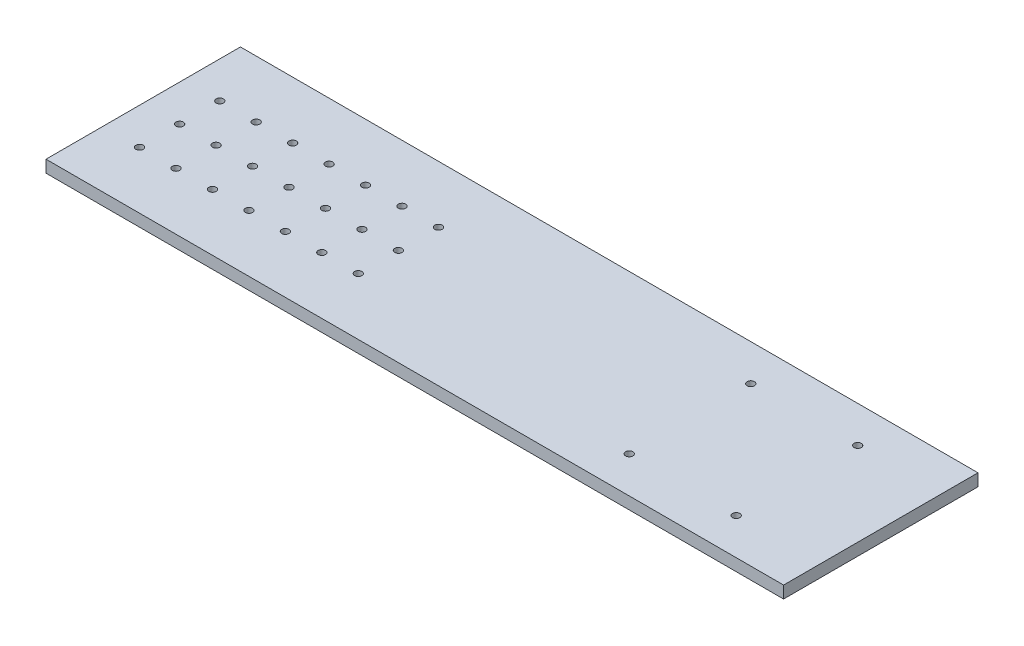
ISO-10303-21;
HEADER;
FILE_DESCRIPTION(('STEP AP214'),'2;1');
FILE_NAME('part.step','',(''),(''),'','','');
FILE_SCHEMA(('AUTOMOTIVE_DESIGN { 1 0 10303 214 1 1 1 1 }'));
ENDSEC;
DATA;
#1=APPLICATION_CONTEXT('core data for automotive mechanical design processes');
#2=APPLICATION_PROTOCOL_DEFINITION('international standard','automotive_design',2000,#1);
#3=PRODUCT_CONTEXT('',#1,'mechanical');
#4=PRODUCT('Part','Part','',(#3));
#5=PRODUCT_RELATED_PRODUCT_CATEGORY('part','',(#4));
#6=PRODUCT_DEFINITION_FORMATION('','',#4);
#7=PRODUCT_DEFINITION_CONTEXT('part definition',#1,'design');
#8=PRODUCT_DEFINITION('design','',#6,#7);
#9=PRODUCT_DEFINITION_SHAPE('','',#8);
#10=(LENGTH_UNIT() NAMED_UNIT(*) SI_UNIT(.MILLI.,.METRE.));
#11=(NAMED_UNIT(*) PLANE_ANGLE_UNIT() SI_UNIT($,.RADIAN.));
#12=(NAMED_UNIT(*) SI_UNIT($,.STERADIAN.) SOLID_ANGLE_UNIT());
#13=UNCERTAINTY_MEASURE_WITH_UNIT(LENGTH_MEASURE(1.E-05),#10,'distance_accuracy_value','');
#14=(GEOMETRIC_REPRESENTATION_CONTEXT(3) GLOBAL_UNCERTAINTY_ASSIGNED_CONTEXT((#13)) GLOBAL_UNIT_ASSIGNED_CONTEXT((#10,
#11,#12)) REPRESENTATION_CONTEXT('',''));
#15=CARTESIAN_POINT('',(0.,0.,0.));
#16=DIRECTION('',(0.,0.,1.));
#17=DIRECTION('',(1.,0.,0.));
#18=AXIS2_PLACEMENT_3D('',#15,#16,#17);
#19=CARTESIAN_POINT('',(303.5,10.,-80.));
#20=DIRECTION('',(-1.,0.,0.));
#21=DIRECTION('',(0.,0.,1.));
#22=AXIS2_PLACEMENT_3D('',#19,#20,#21);
#23=PLANE('',#22);
#24=DIRECTION('',(0.,0.,-1.));
#25=VECTOR('',#24,1.);
#26=CARTESIAN_POINT('',(303.5,0.,-80.));
#27=LINE('',#26,#25);
#28=CARTESIAN_POINT('',(303.5,0.,80.));
#29=VERTEX_POINT('',#28);
#30=CARTESIAN_POINT('',(303.5,0.,-80.));
#31=VERTEX_POINT('',#30);
#32=EDGE_CURVE('E96',#29,#31,#27,.T.);
#33=ORIENTED_EDGE('',*,*,#32,.T.);
#34=DIRECTION('',(0.,-1.,0.));
#35=VECTOR('',#34,1.);
#36=CARTESIAN_POINT('',(303.5,10.,-80.));
#37=LINE('',#36,#35);
#38=CARTESIAN_POINT('',(303.5,10.,-80.));
#39=VERTEX_POINT('',#38);
#40=EDGE_CURVE('E11',#39,#31,#37,.T.);
#41=ORIENTED_EDGE('',*,*,#40,.F.);
#42=DIRECTION('',(0.,0.,-1.));
#43=VECTOR('',#42,1.);
#44=CARTESIAN_POINT('',(303.5,10.,-80.));
#45=LINE('',#44,#43);
#46=CARTESIAN_POINT('',(303.5,10.,80.));
#47=VERTEX_POINT('',#46);
#48=EDGE_CURVE('E84',#47,#39,#45,.T.);
#49=ORIENTED_EDGE('',*,*,#48,.F.);
#50=DIRECTION('',(0.,-1.,0.));
#51=VECTOR('',#50,1.);
#52=CARTESIAN_POINT('',(303.5,10.,80.));
#53=LINE('',#52,#51);
#54=EDGE_CURVE('E92',#47,#29,#53,.T.);
#55=ORIENTED_EDGE('',*,*,#54,.T.);
#56=EDGE_LOOP('',(#33,#41,#49,#55));
#57=FACE_BOUND('',#56,.T.);
#58=ADVANCED_FACE('F33',(#57),#23,.F.);
#59=CARTESIAN_POINT('',(-303.5,10.,-80.));
#60=DIRECTION('',(0.,0.,1.));
#61=DIRECTION('',(1.,0.,0.));
#62=AXIS2_PLACEMENT_3D('',#59,#60,#61);
#63=PLANE('',#62);
#64=DIRECTION('',(-1.,0.,0.));
#65=VECTOR('',#64,1.);
#66=CARTESIAN_POINT('',(-303.5,0.,-80.));
#67=LINE('',#66,#65);
#68=CARTESIAN_POINT('',(-303.5,0.,-80.));
#69=VERTEX_POINT('',#68);
#70=EDGE_CURVE('E88',#31,#69,#67,.T.);
#71=ORIENTED_EDGE('',*,*,#70,.T.);
#72=DIRECTION('',(0.,-1.,0.));
#73=VECTOR('',#72,1.);
#74=CARTESIAN_POINT('',(-303.5,10.,-80.));
#75=LINE('',#74,#73);
#76=CARTESIAN_POINT('',(-303.5,10.,-80.));
#77=VERTEX_POINT('',#76);
#78=EDGE_CURVE('E41',#77,#69,#75,.T.);
#79=ORIENTED_EDGE('',*,*,#78,.F.);
#80=DIRECTION('',(-1.,0.,0.));
#81=VECTOR('',#80,1.);
#82=CARTESIAN_POINT('',(-303.5,10.,-80.));
#83=LINE('',#82,#81);
#84=EDGE_CURVE('E79',#39,#77,#83,.T.);
#85=ORIENTED_EDGE('',*,*,#84,.F.);
#86=ORIENTED_EDGE('',*,*,#40,.T.);
#87=EDGE_LOOP('',(#71,#79,#85,#86));
#88=FACE_BOUND('',#87,.T.);
#89=ADVANCED_FACE('F87',(#88),#63,.F.);
#90=CARTESIAN_POINT('',(-303.5,10.,-80.));
#91=DIRECTION('',(1.,0.,0.));
#92=DIRECTION('',(0.,0.,-1.));
#93=AXIS2_PLACEMENT_3D('',#90,#91,#92);
#94=PLANE('',#93);
#95=DIRECTION('',(0.,0.,1.));
#96=VECTOR('',#95,1.);
#97=CARTESIAN_POINT('',(-303.5,0.,-80.));
#98=LINE('',#97,#96);
#99=CARTESIAN_POINT('',(-303.5,0.,80.));
#100=VERTEX_POINT('',#99);
#101=EDGE_CURVE('E66',#69,#100,#98,.T.);
#102=ORIENTED_EDGE('',*,*,#101,.T.);
#103=DIRECTION('',(0.,-1.,0.));
#104=VECTOR('',#103,1.);
#105=CARTESIAN_POINT('',(-303.5,10.,80.));
#106=LINE('',#105,#104);
#107=CARTESIAN_POINT('',(-303.5,10.,80.));
#108=VERTEX_POINT('',#107);
#109=EDGE_CURVE('E89',#108,#100,#106,.T.);
#110=ORIENTED_EDGE('',*,*,#109,.F.);
#111=DIRECTION('',(0.,0.,1.));
#112=VECTOR('',#111,1.);
#113=CARTESIAN_POINT('',(-303.5,10.,-80.));
#114=LINE('',#113,#112);
#115=EDGE_CURVE('E82',#77,#108,#114,.T.);
#116=ORIENTED_EDGE('',*,*,#115,.F.);
#117=ORIENTED_EDGE('',*,*,#78,.T.);
#118=EDGE_LOOP('',(#102,#110,#116,#117));
#119=FACE_BOUND('',#118,.T.);
#120=ADVANCED_FACE('F90',(#119),#94,.F.);
#121=CARTESIAN_POINT('',(-303.5,10.,80.));
#122=DIRECTION('',(0.,0.,-1.));
#123=DIRECTION('',(-1.,0.,0.));
#124=AXIS2_PLACEMENT_3D('',#121,#122,#123);
#125=PLANE('',#124);
#126=DIRECTION('',(1.,0.,0.));
#127=VECTOR('',#126,1.);
#128=CARTESIAN_POINT('',(-303.5,0.,80.));
#129=LINE('',#128,#127);
#130=EDGE_CURVE('E72',#100,#29,#129,.T.);
#131=ORIENTED_EDGE('',*,*,#130,.T.);
#132=ORIENTED_EDGE('',*,*,#54,.F.);
#133=DIRECTION('',(1.,0.,0.));
#134=VECTOR('',#133,1.);
#135=CARTESIAN_POINT('',(-303.5,10.,80.));
#136=LINE('',#135,#134);
#137=EDGE_CURVE('E49',#108,#47,#136,.T.);
#138=ORIENTED_EDGE('',*,*,#137,.F.);
#139=ORIENTED_EDGE('',*,*,#109,.T.);
#140=EDGE_LOOP('',(#131,#132,#138,#139));
#141=FACE_BOUND('',#140,.T.);
#142=ADVANCED_FACE('F104',(#141),#125,.F.);
#143=CARTESIAN_POINT('',(0.,10.,0.));
#144=DIRECTION('',(0.,1.,0.));
#145=DIRECTION('',(0.,0.,1.));
#146=AXIS2_PLACEMENT_3D('',#143,#144,#145);
#147=PLANE('',#146);
#148=CARTESIAN_POINT('',(-273.5,10.,-4.18977760661176E-13));
#149=DIRECTION('',(0.,1.,0.));
#150=DIRECTION('',(0.,0.,1.));
#151=AXIS2_PLACEMENT_3D('',#148,#149,#150);
#152=CIRCLE('',#151,2.99999999999999);
#153=CARTESIAN_POINT('',(-273.5,10.,2.99999999999958));
#154=VERTEX_POINT('',#153);
#155=EDGE_CURVE('E253',#154,#154,#152,.F.);
#156=ORIENTED_EDGE('',*,*,#155,.T.);
#157=EDGE_LOOP('',(#156));
#158=FACE_BOUND('',#157,.T.);
#159=CARTESIAN_POINT('',(-273.5,10.,-33.0000000000004));
#160=DIRECTION('',(0.,1.,0.));
#161=DIRECTION('',(0.,0.,1.));
#162=AXIS2_PLACEMENT_3D('',#159,#160,#161);
#163=CIRCLE('',#162,2.99999999999999);
#164=CARTESIAN_POINT('',(-273.5,10.,-30.0000000000004));
#165=VERTEX_POINT('',#164);
#166=EDGE_CURVE('E247',#165,#165,#163,.F.);
#167=ORIENTED_EDGE('',*,*,#166,.T.);
#168=EDGE_LOOP('',(#167));
#169=FACE_BOUND('',#168,.T.);
#170=CARTESIAN_POINT('',(-273.5,10.,32.9999999999996));
#171=DIRECTION('',(0.,1.,0.));
#172=DIRECTION('',(0.,0.,1.));
#173=AXIS2_PLACEMENT_3D('',#170,#171,#172);
#174=CIRCLE('',#173,2.99999999999999);
#175=CARTESIAN_POINT('',(-273.5,10.,35.9999999999996));
#176=VERTEX_POINT('',#175);
#177=EDGE_CURVE('E241',#176,#176,#174,.F.);
#178=ORIENTED_EDGE('',*,*,#177,.T.);
#179=EDGE_LOOP('',(#178));
#180=FACE_BOUND('',#179,.T.);
#181=CARTESIAN_POINT('',(-243.5,10.,-2.09488880330588E-13));
#182=DIRECTION('',(0.,1.,0.));
#183=DIRECTION('',(0.,0.,1.));
#184=AXIS2_PLACEMENT_3D('',#181,#182,#183);
#185=CIRCLE('',#184,2.99999999999999);
#186=CARTESIAN_POINT('',(-243.5,10.,2.99999999999979));
#187=VERTEX_POINT('',#186);
#188=EDGE_CURVE('E235',#187,#187,#185,.F.);
#189=ORIENTED_EDGE('',*,*,#188,.T.);
#190=EDGE_LOOP('',(#189));
#191=FACE_BOUND('',#190,.T.);
#192=CARTESIAN_POINT('',(-243.5,10.,-33.0000000000002));
#193=DIRECTION('',(0.,1.,0.));
#194=DIRECTION('',(0.,0.,1.));
#195=AXIS2_PLACEMENT_3D('',#192,#193,#194);
#196=CIRCLE('',#195,2.99999999999999);
#197=CARTESIAN_POINT('',(-243.5,10.,-30.0000000000002));
#198=VERTEX_POINT('',#197);
#199=EDGE_CURVE('E229',#198,#198,#196,.F.);
#200=ORIENTED_EDGE('',*,*,#199,.T.);
#201=EDGE_LOOP('',(#200));
#202=FACE_BOUND('',#201,.T.);
#203=CARTESIAN_POINT('',(-243.5,10.,32.9999999999998));
#204=DIRECTION('',(0.,1.,0.));
#205=DIRECTION('',(0.,0.,1.));
#206=AXIS2_PLACEMENT_3D('',#203,#204,#205);
#207=CIRCLE('',#206,2.99999999999999);
#208=CARTESIAN_POINT('',(-243.5,10.,35.9999999999998));
#209=VERTEX_POINT('',#208);
#210=EDGE_CURVE('E223',#209,#209,#207,.F.);
#211=ORIENTED_EDGE('',*,*,#210,.T.);
#212=EDGE_LOOP('',(#211));
#213=FACE_BOUND('',#212,.T.);
#214=CARTESIAN_POINT('',(-213.5,10.,0.));
#215=DIRECTION('',(0.,1.,0.));
#216=DIRECTION('',(0.,0.,1.));
#217=AXIS2_PLACEMENT_3D('',#214,#215,#216);
#218=CIRCLE('',#217,2.99999999999999);
#219=CARTESIAN_POINT('',(-213.5,10.,2.99999999999999));
#220=VERTEX_POINT('',#219);
#221=EDGE_CURVE('E217',#220,#220,#218,.F.);
#222=ORIENTED_EDGE('',*,*,#221,.T.);
#223=EDGE_LOOP('',(#222));
#224=FACE_BOUND('',#223,.T.);
#225=CARTESIAN_POINT('',(234.5,10.,-50.));
#226=DIRECTION('',(0.,1.,0.));
#227=DIRECTION('',(0.,0.,1.));
#228=AXIS2_PLACEMENT_3D('',#225,#226,#227);
#229=CIRCLE('',#228,2.99999999999999);
#230=CARTESIAN_POINT('',(234.5,10.,-47.));
#231=VERTEX_POINT('',#230);
#232=EDGE_CURVE('E211',#231,#231,#229,.F.);
#233=ORIENTED_EDGE('',*,*,#232,.T.);
#234=EDGE_LOOP('',(#233));
#235=FACE_BOUND('',#234,.T.);
#236=CARTESIAN_POINT('',(234.5,10.,50.));
#237=DIRECTION('',(0.,1.,0.));
#238=DIRECTION('',(0.,0.,1.));
#239=AXIS2_PLACEMENT_3D('',#236,#237,#238);
#240=CIRCLE('',#239,2.99999999999999);
#241=CARTESIAN_POINT('',(234.5,10.,53.));
#242=VERTEX_POINT('',#241);
#243=EDGE_CURVE('E205',#242,#242,#240,.F.);
#244=ORIENTED_EDGE('',*,*,#243,.T.);
#245=EDGE_LOOP('',(#244));
#246=FACE_BOUND('',#245,.T.);
#247=CARTESIAN_POINT('',(146.5,10.,50.));
#248=DIRECTION('',(0.,1.,0.));
#249=DIRECTION('',(0.,0.,1.));
#250=AXIS2_PLACEMENT_3D('',#247,#248,#249);
#251=CIRCLE('',#250,2.99999999999999);
#252=CARTESIAN_POINT('',(146.5,10.,53.));
#253=VERTEX_POINT('',#252);
#254=EDGE_CURVE('E199',#253,#253,#251,.F.);
#255=ORIENTED_EDGE('',*,*,#254,.T.);
#256=EDGE_LOOP('',(#255));
#257=FACE_BOUND('',#256,.T.);
#258=CARTESIAN_POINT('',(146.5,10.,-50.));
#259=DIRECTION('',(0.,1.,0.));
#260=DIRECTION('',(0.,0.,1.));
#261=AXIS2_PLACEMENT_3D('',#258,#259,#260);
#262=CIRCLE('',#261,2.99999999999999);
#263=CARTESIAN_POINT('',(146.5,10.,-47.));
#264=VERTEX_POINT('',#263);
#265=EDGE_CURVE('E193',#264,#264,#262,.F.);
#266=ORIENTED_EDGE('',*,*,#265,.T.);
#267=EDGE_LOOP('',(#266));
#268=FACE_BOUND('',#267,.T.);
#269=CARTESIAN_POINT('',(-93.5000000000003,10.,0.));
#270=DIRECTION('',(0.,1.,0.));
#271=DIRECTION('',(0.,0.,1.));
#272=AXIS2_PLACEMENT_3D('',#269,#270,#271);
#273=CIRCLE('',#272,2.99999999999999);
#274=CARTESIAN_POINT('',(-93.5000000000003,10.,2.99999999999999));
#275=VERTEX_POINT('',#274);
#276=EDGE_CURVE('E187',#275,#275,#273,.F.);
#277=ORIENTED_EDGE('',*,*,#276,.T.);
#278=EDGE_LOOP('',(#277));
#279=FACE_BOUND('',#278,.T.);
#280=CARTESIAN_POINT('',(-93.5000000000003,10.,33.));
#281=DIRECTION('',(0.,1.,0.));
#282=DIRECTION('',(0.,0.,1.));
#283=AXIS2_PLACEMENT_3D('',#280,#281,#282);
#284=CIRCLE('',#283,2.99999999999999);
#285=CARTESIAN_POINT('',(-93.5000000000003,10.,36.));
#286=VERTEX_POINT('',#285);
#287=EDGE_CURVE('E181',#286,#286,#284,.F.);
#288=ORIENTED_EDGE('',*,*,#287,.T.);
#289=EDGE_LOOP('',(#288));
#290=FACE_BOUND('',#289,.T.);
#291=CARTESIAN_POINT('',(-123.5,10.,0.));
#292=DIRECTION('',(0.,1.,0.));
#293=DIRECTION('',(0.,0.,1.));
#294=AXIS2_PLACEMENT_3D('',#291,#292,#293);
#295=CIRCLE('',#294,3.00000000000005);
#296=CARTESIAN_POINT('',(-123.5,10.,3.00000000000005));
#297=VERTEX_POINT('',#296);
#298=EDGE_CURVE('E175',#297,#297,#295,.F.);
#299=ORIENTED_EDGE('',*,*,#298,.T.);
#300=EDGE_LOOP('',(#299));
#301=FACE_BOUND('',#300,.T.);
#302=CARTESIAN_POINT('',(-123.5,10.,33.));
#303=DIRECTION('',(0.,1.,0.));
#304=DIRECTION('',(0.,0.,1.));
#305=AXIS2_PLACEMENT_3D('',#302,#303,#304);
#306=CIRCLE('',#305,3.00000000000005);
#307=CARTESIAN_POINT('',(-123.5,10.,36.));
#308=VERTEX_POINT('',#307);
#309=EDGE_CURVE('E169',#308,#308,#306,.F.);
#310=ORIENTED_EDGE('',*,*,#309,.T.);
#311=EDGE_LOOP('',(#310));
#312=FACE_BOUND('',#311,.T.);
#313=CARTESIAN_POINT('',(-153.5,10.,0.));
#314=DIRECTION('',(0.,1.,0.));
#315=DIRECTION('',(0.,0.,1.));
#316=AXIS2_PLACEMENT_3D('',#313,#314,#315);
#317=CIRCLE('',#316,2.99999999999999);
#318=CARTESIAN_POINT('',(-153.5,10.,2.99999999999999));
#319=VERTEX_POINT('',#318);
#320=EDGE_CURVE('E163',#319,#319,#317,.F.);
#321=ORIENTED_EDGE('',*,*,#320,.T.);
#322=EDGE_LOOP('',(#321));
#323=FACE_BOUND('',#322,.T.);
#324=CARTESIAN_POINT('',(-153.5,10.,33.));
#325=DIRECTION('',(0.,1.,0.));
#326=DIRECTION('',(0.,0.,1.));
#327=AXIS2_PLACEMENT_3D('',#324,#325,#326);
#328=CIRCLE('',#327,2.99999999999999);
#329=CARTESIAN_POINT('',(-153.5,10.,36.));
#330=VERTEX_POINT('',#329);
#331=EDGE_CURVE('E157',#330,#330,#328,.F.);
#332=ORIENTED_EDGE('',*,*,#331,.T.);
#333=EDGE_LOOP('',(#332));
#334=FACE_BOUND('',#333,.T.);
#335=CARTESIAN_POINT('',(-213.5,10.,-33.));
#336=DIRECTION('',(0.,1.,0.));
#337=DIRECTION('',(0.,0.,1.));
#338=AXIS2_PLACEMENT_3D('',#335,#336,#337);
#339=CIRCLE('',#338,2.99999999999999);
#340=CARTESIAN_POINT('',(-213.5,10.,-30.));
#341=VERTEX_POINT('',#340);
#342=EDGE_CURVE('E151',#341,#341,#339,.F.);
#343=ORIENTED_EDGE('',*,*,#342,.T.);
#344=EDGE_LOOP('',(#343));
#345=FACE_BOUND('',#344,.T.);
#346=CARTESIAN_POINT('',(-213.5,10.,33.));
#347=DIRECTION('',(0.,1.,0.));
#348=DIRECTION('',(0.,0.,1.));
#349=AXIS2_PLACEMENT_3D('',#346,#347,#348);
#350=CIRCLE('',#349,2.99999999999999);
#351=CARTESIAN_POINT('',(-213.5,10.,36.));
#352=VERTEX_POINT('',#351);
#353=EDGE_CURVE('E145',#352,#352,#350,.F.);
#354=ORIENTED_EDGE('',*,*,#353,.T.);
#355=EDGE_LOOP('',(#354));
#356=FACE_BOUND('',#355,.T.);
#357=CARTESIAN_POINT('',(-183.5,10.,0.));
#358=DIRECTION('',(0.,1.,0.));
#359=DIRECTION('',(0.,0.,1.));
#360=AXIS2_PLACEMENT_3D('',#357,#358,#359);
#361=CIRCLE('',#360,2.99999999999994);
#362=CARTESIAN_POINT('',(-183.5,10.,2.99999999999994));
#363=VERTEX_POINT('',#362);
#364=EDGE_CURVE('E139',#363,#363,#361,.F.);
#365=ORIENTED_EDGE('',*,*,#364,.T.);
#366=EDGE_LOOP('',(#365));
#367=FACE_BOUND('',#366,.T.);
#368=CARTESIAN_POINT('',(-183.5,10.,33.));
#369=DIRECTION('',(0.,1.,0.));
#370=DIRECTION('',(0.,0.,1.));
#371=AXIS2_PLACEMENT_3D('',#368,#369,#370);
#372=CIRCLE('',#371,2.99999999999994);
#373=CARTESIAN_POINT('',(-183.5,10.,35.9999999999999));
#374=VERTEX_POINT('',#373);
#375=EDGE_CURVE('E133',#374,#374,#372,.F.);
#376=ORIENTED_EDGE('',*,*,#375,.T.);
#377=EDGE_LOOP('',(#376));
#378=FACE_BOUND('',#377,.T.);
#379=CARTESIAN_POINT('',(-183.5,10.,-33.));
#380=DIRECTION('',(0.,1.,0.));
#381=DIRECTION('',(0.,0.,1.));
#382=AXIS2_PLACEMENT_3D('',#379,#380,#381);
#383=CIRCLE('',#382,2.99999999999994);
#384=CARTESIAN_POINT('',(-183.5,10.,-30.0000000000001));
#385=VERTEX_POINT('',#384);
#386=EDGE_CURVE('E127',#385,#385,#383,.F.);
#387=ORIENTED_EDGE('',*,*,#386,.T.);
#388=EDGE_LOOP('',(#387));
#389=FACE_BOUND('',#388,.T.);
#390=CARTESIAN_POINT('',(-153.5,10.,-33.));
#391=DIRECTION('',(0.,1.,0.));
#392=DIRECTION('',(0.,0.,1.));
#393=AXIS2_PLACEMENT_3D('',#390,#391,#392);
#394=CIRCLE('',#393,2.99999999999999);
#395=CARTESIAN_POINT('',(-153.5,10.,-30.));
#396=VERTEX_POINT('',#395);
#397=EDGE_CURVE('E121',#396,#396,#394,.F.);
#398=ORIENTED_EDGE('',*,*,#397,.T.);
#399=EDGE_LOOP('',(#398));
#400=FACE_BOUND('',#399,.T.);
#401=CARTESIAN_POINT('',(-123.5,10.,-33.));
#402=DIRECTION('',(0.,1.,0.));
#403=DIRECTION('',(0.,0.,1.));
#404=AXIS2_PLACEMENT_3D('',#401,#402,#403);
#405=CIRCLE('',#404,3.00000000000005);
#406=CARTESIAN_POINT('',(-123.5,10.,-30.));
#407=VERTEX_POINT('',#406);
#408=EDGE_CURVE('E115',#407,#407,#405,.F.);
#409=ORIENTED_EDGE('',*,*,#408,.T.);
#410=EDGE_LOOP('',(#409));
#411=FACE_BOUND('',#410,.T.);
#412=CARTESIAN_POINT('',(-93.5000000000003,10.,-33.));
#413=DIRECTION('',(0.,1.,0.));
#414=DIRECTION('',(0.,0.,1.));
#415=AXIS2_PLACEMENT_3D('',#412,#413,#414);
#416=CIRCLE('',#415,2.99999999999999);
#417=CARTESIAN_POINT('',(-93.5000000000003,10.,-30.));
#418=VERTEX_POINT('',#417);
#419=EDGE_CURVE('E99',#418,#418,#416,.F.);
#420=ORIENTED_EDGE('',*,*,#419,.T.);
#421=EDGE_LOOP('',(#420));
#422=FACE_BOUND('',#421,.T.);
#423=ORIENTED_EDGE('',*,*,#48,.T.);
#424=ORIENTED_EDGE('',*,*,#84,.T.);
#425=ORIENTED_EDGE('',*,*,#115,.T.);
#426=ORIENTED_EDGE('',*,*,#137,.T.);
#427=EDGE_LOOP('',(#423,#424,#425,#426));
#428=FACE_BOUND('',#427,.T.);
#429=ADVANCED_FACE('F80',(#158,#169,#180,#191,#202,#213,#224,#235,#246,#257,#268,#279,#290,#301,
#312,#323,#334,#345,#356,#367,#378,#389,#400,#411,#422,#428),#147,.T.);
#430=CARTESIAN_POINT('',(0.,0.,0.));
#431=DIRECTION('',(0.,1.,0.));
#432=DIRECTION('',(0.,0.,1.));
#433=AXIS2_PLACEMENT_3D('',#430,#431,#432);
#434=PLANE('',#433);
#435=CARTESIAN_POINT('',(-273.5,0.,-4.18977760661176E-13));
#436=DIRECTION('',(0.,-1.,0.));
#437=DIRECTION('',(0.,0.,-1.));
#438=AXIS2_PLACEMENT_3D('',#435,#436,#437);
#439=CIRCLE('',#438,2.99999999999999);
#440=CARTESIAN_POINT('',(-273.5,0.,-3.00000000000041));
#441=VERTEX_POINT('',#440);
#442=EDGE_CURVE('E256',#441,#441,#439,.T.);
#443=ORIENTED_EDGE('',*,*,#442,.F.);
#444=EDGE_LOOP('',(#443));
#445=FACE_BOUND('',#444,.T.);
#446=CARTESIAN_POINT('',(-273.5,0.,-33.0000000000004));
#447=DIRECTION('',(0.,-1.,0.));
#448=DIRECTION('',(0.,0.,-1.));
#449=AXIS2_PLACEMENT_3D('',#446,#447,#448);
#450=CIRCLE('',#449,2.99999999999999);
#451=CARTESIAN_POINT('',(-273.5,0.,-36.0000000000004));
#452=VERTEX_POINT('',#451);
#453=EDGE_CURVE('E250',#452,#452,#450,.T.);
#454=ORIENTED_EDGE('',*,*,#453,.F.);
#455=EDGE_LOOP('',(#454));
#456=FACE_BOUND('',#455,.T.);
#457=CARTESIAN_POINT('',(-273.5,0.,32.9999999999996));
#458=DIRECTION('',(0.,-1.,0.));
#459=DIRECTION('',(0.,0.,1.));
#460=AXIS2_PLACEMENT_3D('',#457,#458,#459);
#461=CIRCLE('',#460,2.99999999999999);
#462=CARTESIAN_POINT('',(-273.5,0.,35.9999999999996));
#463=VERTEX_POINT('',#462);
#464=EDGE_CURVE('E244',#463,#463,#461,.T.);
#465=ORIENTED_EDGE('',*,*,#464,.F.);
#466=EDGE_LOOP('',(#465));
#467=FACE_BOUND('',#466,.T.);
#468=CARTESIAN_POINT('',(-243.5,0.,-2.09488880330588E-13));
#469=DIRECTION('',(0.,-1.,0.));
#470=DIRECTION('',(0.,0.,-1.));
#471=AXIS2_PLACEMENT_3D('',#468,#469,#470);
#472=CIRCLE('',#471,2.99999999999999);
#473=CARTESIAN_POINT('',(-243.5,0.,-3.0000000000002));
#474=VERTEX_POINT('',#473);
#475=EDGE_CURVE('E238',#474,#474,#472,.T.);
#476=ORIENTED_EDGE('',*,*,#475,.F.);
#477=EDGE_LOOP('',(#476));
#478=FACE_BOUND('',#477,.T.);
#479=CARTESIAN_POINT('',(-243.5,0.,-33.0000000000002));
#480=DIRECTION('',(0.,-1.,0.));
#481=DIRECTION('',(0.,0.,-1.));
#482=AXIS2_PLACEMENT_3D('',#479,#480,#481);
#483=CIRCLE('',#482,2.99999999999999);
#484=CARTESIAN_POINT('',(-243.5,0.,-36.0000000000002));
#485=VERTEX_POINT('',#484);
#486=EDGE_CURVE('E232',#485,#485,#483,.T.);
#487=ORIENTED_EDGE('',*,*,#486,.F.);
#488=EDGE_LOOP('',(#487));
#489=FACE_BOUND('',#488,.T.);
#490=CARTESIAN_POINT('',(-243.5,0.,32.9999999999998));
#491=DIRECTION('',(0.,-1.,0.));
#492=DIRECTION('',(0.,0.,1.));
#493=AXIS2_PLACEMENT_3D('',#490,#491,#492);
#494=CIRCLE('',#493,2.99999999999999);
#495=CARTESIAN_POINT('',(-243.5,0.,35.9999999999998));
#496=VERTEX_POINT('',#495);
#497=EDGE_CURVE('E226',#496,#496,#494,.T.);
#498=ORIENTED_EDGE('',*,*,#497,.F.);
#499=EDGE_LOOP('',(#498));
#500=FACE_BOUND('',#499,.T.);
#501=CARTESIAN_POINT('',(-213.5,0.,0.));
#502=DIRECTION('',(0.,-1.,0.));
#503=DIRECTION('',(0.,0.,-1.));
#504=AXIS2_PLACEMENT_3D('',#501,#502,#503);
#505=CIRCLE('',#504,2.99999999999999);
#506=CARTESIAN_POINT('',(-213.5,0.,-2.99999999999999));
#507=VERTEX_POINT('',#506);
#508=EDGE_CURVE('E220',#507,#507,#505,.T.);
#509=ORIENTED_EDGE('',*,*,#508,.F.);
#510=EDGE_LOOP('',(#509));
#511=FACE_BOUND('',#510,.T.);
#512=CARTESIAN_POINT('',(234.5,0.,-50.));
#513=DIRECTION('',(0.,-1.,0.));
#514=DIRECTION('',(0.,0.,1.));
#515=AXIS2_PLACEMENT_3D('',#512,#513,#514);
#516=CIRCLE('',#515,2.99999999999999);
#517=CARTESIAN_POINT('',(234.5,0.,-47.));
#518=VERTEX_POINT('',#517);
#519=EDGE_CURVE('E214',#518,#518,#516,.T.);
#520=ORIENTED_EDGE('',*,*,#519,.F.);
#521=EDGE_LOOP('',(#520));
#522=FACE_BOUND('',#521,.T.);
#523=CARTESIAN_POINT('',(234.5,0.,50.));
#524=DIRECTION('',(0.,-1.,0.));
#525=DIRECTION('',(0.,0.,-1.));
#526=AXIS2_PLACEMENT_3D('',#523,#524,#525);
#527=CIRCLE('',#526,2.99999999999999);
#528=CARTESIAN_POINT('',(234.5,0.,47.));
#529=VERTEX_POINT('',#528);
#530=EDGE_CURVE('E208',#529,#529,#527,.T.);
#531=ORIENTED_EDGE('',*,*,#530,.F.);
#532=EDGE_LOOP('',(#531));
#533=FACE_BOUND('',#532,.T.);
#534=CARTESIAN_POINT('',(146.5,0.,50.));
#535=DIRECTION('',(0.,-1.,0.));
#536=DIRECTION('',(0.,0.,-1.));
#537=AXIS2_PLACEMENT_3D('',#534,#535,#536);
#538=CIRCLE('',#537,2.99999999999999);
#539=CARTESIAN_POINT('',(146.5,0.,47.));
#540=VERTEX_POINT('',#539);
#541=EDGE_CURVE('E202',#540,#540,#538,.T.);
#542=ORIENTED_EDGE('',*,*,#541,.F.);
#543=EDGE_LOOP('',(#542));
#544=FACE_BOUND('',#543,.T.);
#545=CARTESIAN_POINT('',(146.5,0.,-50.));
#546=DIRECTION('',(0.,-1.,0.));
#547=DIRECTION('',(0.,0.,1.));
#548=AXIS2_PLACEMENT_3D('',#545,#546,#547);
#549=CIRCLE('',#548,2.99999999999999);
#550=CARTESIAN_POINT('',(146.5,0.,-47.));
#551=VERTEX_POINT('',#550);
#552=EDGE_CURVE('E196',#551,#551,#549,.T.);
#553=ORIENTED_EDGE('',*,*,#552,.F.);
#554=EDGE_LOOP('',(#553));
#555=FACE_BOUND('',#554,.T.);
#556=CARTESIAN_POINT('',(-93.5000000000003,0.,0.));
#557=DIRECTION('',(0.,-1.,0.));
#558=DIRECTION('',(0.,0.,-1.));
#559=AXIS2_PLACEMENT_3D('',#556,#557,#558);
#560=CIRCLE('',#559,2.99999999999999);
#561=CARTESIAN_POINT('',(-93.5000000000003,0.,-2.99999999999999));
#562=VERTEX_POINT('',#561);
#563=EDGE_CURVE('E190',#562,#562,#560,.T.);
#564=ORIENTED_EDGE('',*,*,#563,.F.);
#565=EDGE_LOOP('',(#564));
#566=FACE_BOUND('',#565,.T.);
#567=CARTESIAN_POINT('',(-93.5000000000003,0.,33.));
#568=DIRECTION('',(0.,-1.,0.));
#569=DIRECTION('',(0.,0.,1.));
#570=AXIS2_PLACEMENT_3D('',#567,#568,#569);
#571=CIRCLE('',#570,2.99999999999999);
#572=CARTESIAN_POINT('',(-93.5000000000003,0.,36.));
#573=VERTEX_POINT('',#572);
#574=EDGE_CURVE('E184',#573,#573,#571,.T.);
#575=ORIENTED_EDGE('',*,*,#574,.F.);
#576=EDGE_LOOP('',(#575));
#577=FACE_BOUND('',#576,.T.);
#578=CARTESIAN_POINT('',(-123.5,0.,0.));
#579=DIRECTION('',(0.,-1.,0.));
#580=DIRECTION('',(0.,0.,-1.));
#581=AXIS2_PLACEMENT_3D('',#578,#579,#580);
#582=CIRCLE('',#581,3.00000000000005);
#583=CARTESIAN_POINT('',(-123.5,0.,-3.00000000000005));
#584=VERTEX_POINT('',#583);
#585=EDGE_CURVE('E178',#584,#584,#582,.T.);
#586=ORIENTED_EDGE('',*,*,#585,.F.);
#587=EDGE_LOOP('',(#586));
#588=FACE_BOUND('',#587,.T.);
#589=CARTESIAN_POINT('',(-123.5,0.,33.));
#590=DIRECTION('',(0.,-1.,0.));
#591=DIRECTION('',(0.,0.,1.));
#592=AXIS2_PLACEMENT_3D('',#589,#590,#591);
#593=CIRCLE('',#592,3.00000000000005);
#594=CARTESIAN_POINT('',(-123.5,0.,36.));
#595=VERTEX_POINT('',#594);
#596=EDGE_CURVE('E172',#595,#595,#593,.T.);
#597=ORIENTED_EDGE('',*,*,#596,.F.);
#598=EDGE_LOOP('',(#597));
#599=FACE_BOUND('',#598,.T.);
#600=CARTESIAN_POINT('',(-153.5,0.,0.));
#601=DIRECTION('',(0.,-1.,0.));
#602=DIRECTION('',(0.,0.,-1.));
#603=AXIS2_PLACEMENT_3D('',#600,#601,#602);
#604=CIRCLE('',#603,2.99999999999999);
#605=CARTESIAN_POINT('',(-153.5,0.,-2.99999999999999));
#606=VERTEX_POINT('',#605);
#607=EDGE_CURVE('E166',#606,#606,#604,.T.);
#608=ORIENTED_EDGE('',*,*,#607,.F.);
#609=EDGE_LOOP('',(#608));
#610=FACE_BOUND('',#609,.T.);
#611=CARTESIAN_POINT('',(-153.5,0.,33.));
#612=DIRECTION('',(0.,-1.,0.));
#613=DIRECTION('',(0.,0.,1.));
#614=AXIS2_PLACEMENT_3D('',#611,#612,#613);
#615=CIRCLE('',#614,2.99999999999999);
#616=CARTESIAN_POINT('',(-153.5,0.,36.));
#617=VERTEX_POINT('',#616);
#618=EDGE_CURVE('E160',#617,#617,#615,.T.);
#619=ORIENTED_EDGE('',*,*,#618,.F.);
#620=EDGE_LOOP('',(#619));
#621=FACE_BOUND('',#620,.T.);
#622=CARTESIAN_POINT('',(-213.5,0.,-33.));
#623=DIRECTION('',(0.,-1.,0.));
#624=DIRECTION('',(0.,0.,-1.));
#625=AXIS2_PLACEMENT_3D('',#622,#623,#624);
#626=CIRCLE('',#625,2.99999999999999);
#627=CARTESIAN_POINT('',(-213.5,0.,-36.));
#628=VERTEX_POINT('',#627);
#629=EDGE_CURVE('E154',#628,#628,#626,.T.);
#630=ORIENTED_EDGE('',*,*,#629,.F.);
#631=EDGE_LOOP('',(#630));
#632=FACE_BOUND('',#631,.T.);
#633=CARTESIAN_POINT('',(-213.5,0.,33.));
#634=DIRECTION('',(0.,-1.,0.));
#635=DIRECTION('',(0.,0.,1.));
#636=AXIS2_PLACEMENT_3D('',#633,#634,#635);
#637=CIRCLE('',#636,2.99999999999999);
#638=CARTESIAN_POINT('',(-213.5,0.,36.));
#639=VERTEX_POINT('',#638);
#640=EDGE_CURVE('E148',#639,#639,#637,.T.);
#641=ORIENTED_EDGE('',*,*,#640,.F.);
#642=EDGE_LOOP('',(#641));
#643=FACE_BOUND('',#642,.T.);
#644=CARTESIAN_POINT('',(-183.5,0.,0.));
#645=DIRECTION('',(0.,-1.,0.));
#646=DIRECTION('',(0.,0.,-1.));
#647=AXIS2_PLACEMENT_3D('',#644,#645,#646);
#648=CIRCLE('',#647,2.99999999999994);
#649=CARTESIAN_POINT('',(-183.5,0.,-2.99999999999994));
#650=VERTEX_POINT('',#649);
#651=EDGE_CURVE('E142',#650,#650,#648,.T.);
#652=ORIENTED_EDGE('',*,*,#651,.F.);
#653=EDGE_LOOP('',(#652));
#654=FACE_BOUND('',#653,.T.);
#655=CARTESIAN_POINT('',(-183.5,0.,33.));
#656=DIRECTION('',(0.,-1.,0.));
#657=DIRECTION('',(0.,0.,1.));
#658=AXIS2_PLACEMENT_3D('',#655,#656,#657);
#659=CIRCLE('',#658,2.99999999999994);
#660=CARTESIAN_POINT('',(-183.5,0.,35.9999999999999));
#661=VERTEX_POINT('',#660);
#662=EDGE_CURVE('E136',#661,#661,#659,.T.);
#663=ORIENTED_EDGE('',*,*,#662,.F.);
#664=EDGE_LOOP('',(#663));
#665=FACE_BOUND('',#664,.T.);
#666=CARTESIAN_POINT('',(-183.5,0.,-33.));
#667=DIRECTION('',(0.,-1.,0.));
#668=DIRECTION('',(0.,0.,-1.));
#669=AXIS2_PLACEMENT_3D('',#666,#667,#668);
#670=CIRCLE('',#669,2.99999999999994);
#671=CARTESIAN_POINT('',(-183.5,0.,-35.9999999999999));
#672=VERTEX_POINT('',#671);
#673=EDGE_CURVE('E130',#672,#672,#670,.T.);
#674=ORIENTED_EDGE('',*,*,#673,.F.);
#675=EDGE_LOOP('',(#674));
#676=FACE_BOUND('',#675,.T.);
#677=CARTESIAN_POINT('',(-153.5,0.,-33.));
#678=DIRECTION('',(0.,-1.,0.));
#679=DIRECTION('',(0.,0.,-1.));
#680=AXIS2_PLACEMENT_3D('',#677,#678,#679);
#681=CIRCLE('',#680,2.99999999999999);
#682=CARTESIAN_POINT('',(-153.5,0.,-36.));
#683=VERTEX_POINT('',#682);
#684=EDGE_CURVE('E124',#683,#683,#681,.T.);
#685=ORIENTED_EDGE('',*,*,#684,.F.);
#686=EDGE_LOOP('',(#685));
#687=FACE_BOUND('',#686,.T.);
#688=CARTESIAN_POINT('',(-123.5,0.,-33.));
#689=DIRECTION('',(0.,-1.,0.));
#690=DIRECTION('',(0.,0.,-1.));
#691=AXIS2_PLACEMENT_3D('',#688,#689,#690);
#692=CIRCLE('',#691,3.00000000000005);
#693=CARTESIAN_POINT('',(-123.5,0.,-36.));
#694=VERTEX_POINT('',#693);
#695=EDGE_CURVE('E118',#694,#694,#692,.T.);
#696=ORIENTED_EDGE('',*,*,#695,.F.);
#697=EDGE_LOOP('',(#696));
#698=FACE_BOUND('',#697,.T.);
#699=CARTESIAN_POINT('',(-93.5000000000003,0.,-33.));
#700=DIRECTION('',(0.,-1.,0.));
#701=DIRECTION('',(0.,0.,-1.));
#702=AXIS2_PLACEMENT_3D('',#699,#700,#701);
#703=CIRCLE('',#702,2.99999999999999);
#704=CARTESIAN_POINT('',(-93.5000000000003,0.,-36.));
#705=VERTEX_POINT('',#704);
#706=EDGE_CURVE('E112',#705,#705,#703,.T.);
#707=ORIENTED_EDGE('',*,*,#706,.F.);
#708=EDGE_LOOP('',(#707));
#709=FACE_BOUND('',#708,.T.);
#710=ORIENTED_EDGE('',*,*,#32,.F.);
#711=ORIENTED_EDGE('',*,*,#130,.F.);
#712=ORIENTED_EDGE('',*,*,#101,.F.);
#713=ORIENTED_EDGE('',*,*,#70,.F.);
#714=EDGE_LOOP('',(#710,#711,#712,#713));
#715=FACE_BOUND('',#714,.T.);
#716=ADVANCED_FACE('F107',(#445,#456,#467,#478,#489,#500,#511,#522,#533,#544,#555,#566,#577,
#588,#599,#610,#621,#632,#643,#654,#665,#676,#687,#698,#709,#715),#434,.F.);
#717=CARTESIAN_POINT('',(-93.5000000000003,18.4852813742387,-33.));
#718=DIRECTION('',(0.,-1.,0.));
#719=DIRECTION('',(0.,0.,-1.));
#720=AXIS2_PLACEMENT_3D('',#717,#718,#719);
#721=CYLINDRICAL_SURFACE('',#720,2.99999999999999);
#722=ORIENTED_EDGE('',*,*,#706,.T.);
#723=EDGE_LOOP('',(#722));
#724=FACE_BOUND('',#723,.T.);
#725=ORIENTED_EDGE('',*,*,#419,.F.);
#726=EDGE_LOOP('',(#725));
#727=FACE_BOUND('',#726,.T.);
#728=ADVANCED_FACE('F265',(#724,#727),#721,.F.);
#729=CARTESIAN_POINT('',(-123.5,18.4852813742387,-33.));
#730=DIRECTION('',(0.,-1.,0.));
#731=DIRECTION('',(0.,0.,-1.));
#732=AXIS2_PLACEMENT_3D('',#729,#730,#731);
#733=CYLINDRICAL_SURFACE('',#732,3.00000000000005);
#734=ORIENTED_EDGE('',*,*,#695,.T.);
#735=EDGE_LOOP('',(#734));
#736=FACE_BOUND('',#735,.T.);
#737=ORIENTED_EDGE('',*,*,#408,.F.);
#738=EDGE_LOOP('',(#737));
#739=FACE_BOUND('',#738,.T.);
#740=ADVANCED_FACE('F317',(#736,#739),#733,.F.);
#741=CARTESIAN_POINT('',(-153.5,18.4852813742387,-33.));
#742=DIRECTION('',(0.,-1.,0.));
#743=DIRECTION('',(0.,0.,-1.));
#744=AXIS2_PLACEMENT_3D('',#741,#742,#743);
#745=CYLINDRICAL_SURFACE('',#744,2.99999999999999);
#746=ORIENTED_EDGE('',*,*,#684,.T.);
#747=EDGE_LOOP('',(#746));
#748=FACE_BOUND('',#747,.T.);
#749=ORIENTED_EDGE('',*,*,#397,.F.);
#750=EDGE_LOOP('',(#749));
#751=FACE_BOUND('',#750,.T.);
#752=ADVANCED_FACE('F368',(#748,#751),#745,.F.);
#753=CARTESIAN_POINT('',(-183.5,18.4852813742387,-33.));
#754=DIRECTION('',(0.,-1.,0.));
#755=DIRECTION('',(0.,0.,-1.));
#756=AXIS2_PLACEMENT_3D('',#753,#754,#755);
#757=CYLINDRICAL_SURFACE('',#756,2.99999999999994);
#758=ORIENTED_EDGE('',*,*,#673,.T.);
#759=EDGE_LOOP('',(#758));
#760=FACE_BOUND('',#759,.T.);
#761=ORIENTED_EDGE('',*,*,#386,.F.);
#762=EDGE_LOOP('',(#761));
#763=FACE_BOUND('',#762,.T.);
#764=ADVANCED_FACE('F378',(#760,#763),#757,.F.);
#765=CARTESIAN_POINT('',(-183.5,18.4852813742387,33.));
#766=DIRECTION('',(0.,-1.,0.));
#767=DIRECTION('',(0.,0.,-1.));
#768=AXIS2_PLACEMENT_3D('',#765,#766,#767);
#769=CYLINDRICAL_SURFACE('',#768,2.99999999999994);
#770=ORIENTED_EDGE('',*,*,#662,.T.);
#771=EDGE_LOOP('',(#770));
#772=FACE_BOUND('',#771,.T.);
#773=ORIENTED_EDGE('',*,*,#375,.F.);
#774=EDGE_LOOP('',(#773));
#775=FACE_BOUND('',#774,.T.);
#776=ADVANCED_FACE('F388',(#772,#775),#769,.F.);
#777=CARTESIAN_POINT('',(-183.5,18.4852813742387,0.));
#778=DIRECTION('',(0.,-1.,0.));
#779=DIRECTION('',(0.,0.,-1.));
#780=AXIS2_PLACEMENT_3D('',#777,#778,#779);
#781=CYLINDRICAL_SURFACE('',#780,2.99999999999994);
#782=ORIENTED_EDGE('',*,*,#651,.T.);
#783=EDGE_LOOP('',(#782));
#784=FACE_BOUND('',#783,.T.);
#785=ORIENTED_EDGE('',*,*,#364,.F.);
#786=EDGE_LOOP('',(#785));
#787=FACE_BOUND('',#786,.T.);
#788=ADVANCED_FACE('F398',(#784,#787),#781,.F.);
#789=CARTESIAN_POINT('',(-213.5,18.4852813742387,33.));
#790=DIRECTION('',(0.,-1.,0.));
#791=DIRECTION('',(0.,0.,-1.));
#792=AXIS2_PLACEMENT_3D('',#789,#790,#791);
#793=CYLINDRICAL_SURFACE('',#792,2.99999999999999);
#794=ORIENTED_EDGE('',*,*,#640,.T.);
#795=EDGE_LOOP('',(#794));
#796=FACE_BOUND('',#795,.T.);
#797=ORIENTED_EDGE('',*,*,#353,.F.);
#798=EDGE_LOOP('',(#797));
#799=FACE_BOUND('',#798,.T.);
#800=ADVANCED_FACE('F408',(#796,#799),#793,.F.);
#801=CARTESIAN_POINT('',(-213.5,18.4852813742387,-33.));
#802=DIRECTION('',(0.,-1.,0.));
#803=DIRECTION('',(0.,0.,-1.));
#804=AXIS2_PLACEMENT_3D('',#801,#802,#803);
#805=CYLINDRICAL_SURFACE('',#804,2.99999999999999);
#806=ORIENTED_EDGE('',*,*,#629,.T.);
#807=EDGE_LOOP('',(#806));
#808=FACE_BOUND('',#807,.T.);
#809=ORIENTED_EDGE('',*,*,#342,.F.);
#810=EDGE_LOOP('',(#809));
#811=FACE_BOUND('',#810,.T.);
#812=ADVANCED_FACE('F418',(#808,#811),#805,.F.);
#813=CARTESIAN_POINT('',(-153.5,18.4852813742387,33.));
#814=DIRECTION('',(0.,-1.,0.));
#815=DIRECTION('',(0.,0.,-1.));
#816=AXIS2_PLACEMENT_3D('',#813,#814,#815);
#817=CYLINDRICAL_SURFACE('',#816,2.99999999999999);
#818=ORIENTED_EDGE('',*,*,#618,.T.);
#819=EDGE_LOOP('',(#818));
#820=FACE_BOUND('',#819,.T.);
#821=ORIENTED_EDGE('',*,*,#331,.F.);
#822=EDGE_LOOP('',(#821));
#823=FACE_BOUND('',#822,.T.);
#824=ADVANCED_FACE('F428',(#820,#823),#817,.F.);
#825=CARTESIAN_POINT('',(-153.5,18.4852813742387,0.));
#826=DIRECTION('',(0.,-1.,0.));
#827=DIRECTION('',(0.,0.,-1.));
#828=AXIS2_PLACEMENT_3D('',#825,#826,#827);
#829=CYLINDRICAL_SURFACE('',#828,2.99999999999999);
#830=ORIENTED_EDGE('',*,*,#607,.T.);
#831=EDGE_LOOP('',(#830));
#832=FACE_BOUND('',#831,.T.);
#833=ORIENTED_EDGE('',*,*,#320,.F.);
#834=EDGE_LOOP('',(#833));
#835=FACE_BOUND('',#834,.T.);
#836=ADVANCED_FACE('F438',(#832,#835),#829,.F.);
#837=CARTESIAN_POINT('',(-123.5,18.4852813742387,33.));
#838=DIRECTION('',(0.,-1.,0.));
#839=DIRECTION('',(0.,0.,-1.));
#840=AXIS2_PLACEMENT_3D('',#837,#838,#839);
#841=CYLINDRICAL_SURFACE('',#840,3.00000000000005);
#842=ORIENTED_EDGE('',*,*,#596,.T.);
#843=EDGE_LOOP('',(#842));
#844=FACE_BOUND('',#843,.T.);
#845=ORIENTED_EDGE('',*,*,#309,.F.);
#846=EDGE_LOOP('',(#845));
#847=FACE_BOUND('',#846,.T.);
#848=ADVANCED_FACE('F448',(#844,#847),#841,.F.);
#849=CARTESIAN_POINT('',(-123.5,18.4852813742387,0.));
#850=DIRECTION('',(0.,-1.,0.));
#851=DIRECTION('',(0.,0.,-1.));
#852=AXIS2_PLACEMENT_3D('',#849,#850,#851);
#853=CYLINDRICAL_SURFACE('',#852,3.00000000000005);
#854=ORIENTED_EDGE('',*,*,#585,.T.);
#855=EDGE_LOOP('',(#854));
#856=FACE_BOUND('',#855,.T.);
#857=ORIENTED_EDGE('',*,*,#298,.F.);
#858=EDGE_LOOP('',(#857));
#859=FACE_BOUND('',#858,.T.);
#860=ADVANCED_FACE('F458',(#856,#859),#853,.F.);
#861=CARTESIAN_POINT('',(-93.5000000000003,18.4852813742387,33.));
#862=DIRECTION('',(0.,-1.,0.));
#863=DIRECTION('',(0.,0.,-1.));
#864=AXIS2_PLACEMENT_3D('',#861,#862,#863);
#865=CYLINDRICAL_SURFACE('',#864,2.99999999999999);
#866=ORIENTED_EDGE('',*,*,#574,.T.);
#867=EDGE_LOOP('',(#866));
#868=FACE_BOUND('',#867,.T.);
#869=ORIENTED_EDGE('',*,*,#287,.F.);
#870=EDGE_LOOP('',(#869));
#871=FACE_BOUND('',#870,.T.);
#872=ADVANCED_FACE('F468',(#868,#871),#865,.F.);
#873=CARTESIAN_POINT('',(-93.5000000000003,18.4852813742387,0.));
#874=DIRECTION('',(0.,-1.,0.));
#875=DIRECTION('',(0.,0.,-1.));
#876=AXIS2_PLACEMENT_3D('',#873,#874,#875);
#877=CYLINDRICAL_SURFACE('',#876,2.99999999999999);
#878=ORIENTED_EDGE('',*,*,#563,.T.);
#879=EDGE_LOOP('',(#878));
#880=FACE_BOUND('',#879,.T.);
#881=ORIENTED_EDGE('',*,*,#276,.F.);
#882=EDGE_LOOP('',(#881));
#883=FACE_BOUND('',#882,.T.);
#884=ADVANCED_FACE('F478',(#880,#883),#877,.F.);
#885=CARTESIAN_POINT('',(146.5,18.4852813742387,-50.));
#886=DIRECTION('',(0.,-1.,0.));
#887=DIRECTION('',(0.,0.,-1.));
#888=AXIS2_PLACEMENT_3D('',#885,#886,#887);
#889=CYLINDRICAL_SURFACE('',#888,2.99999999999999);
#890=ORIENTED_EDGE('',*,*,#552,.T.);
#891=EDGE_LOOP('',(#890));
#892=FACE_BOUND('',#891,.T.);
#893=ORIENTED_EDGE('',*,*,#265,.F.);
#894=EDGE_LOOP('',(#893));
#895=FACE_BOUND('',#894,.T.);
#896=ADVANCED_FACE('F488',(#892,#895),#889,.F.);
#897=CARTESIAN_POINT('',(146.5,18.4852813742387,50.));
#898=DIRECTION('',(0.,-1.,0.));
#899=DIRECTION('',(0.,0.,-1.));
#900=AXIS2_PLACEMENT_3D('',#897,#898,#899);
#901=CYLINDRICAL_SURFACE('',#900,2.99999999999999);
#902=ORIENTED_EDGE('',*,*,#541,.T.);
#903=EDGE_LOOP('',(#902));
#904=FACE_BOUND('',#903,.T.);
#905=ORIENTED_EDGE('',*,*,#254,.F.);
#906=EDGE_LOOP('',(#905));
#907=FACE_BOUND('',#906,.T.);
#908=ADVANCED_FACE('F498',(#904,#907),#901,.F.);
#909=CARTESIAN_POINT('',(234.5,18.4852813742387,50.));
#910=DIRECTION('',(0.,-1.,0.));
#911=DIRECTION('',(0.,0.,-1.));
#912=AXIS2_PLACEMENT_3D('',#909,#910,#911);
#913=CYLINDRICAL_SURFACE('',#912,2.99999999999999);
#914=ORIENTED_EDGE('',*,*,#530,.T.);
#915=EDGE_LOOP('',(#914));
#916=FACE_BOUND('',#915,.T.);
#917=ORIENTED_EDGE('',*,*,#243,.F.);
#918=EDGE_LOOP('',(#917));
#919=FACE_BOUND('',#918,.T.);
#920=ADVANCED_FACE('F508',(#916,#919),#913,.F.);
#921=CARTESIAN_POINT('',(234.5,18.4852813742387,-50.));
#922=DIRECTION('',(0.,-1.,0.));
#923=DIRECTION('',(0.,0.,-1.));
#924=AXIS2_PLACEMENT_3D('',#921,#922,#923);
#925=CYLINDRICAL_SURFACE('',#924,2.99999999999999);
#926=ORIENTED_EDGE('',*,*,#519,.T.);
#927=EDGE_LOOP('',(#926));
#928=FACE_BOUND('',#927,.T.);
#929=ORIENTED_EDGE('',*,*,#232,.F.);
#930=EDGE_LOOP('',(#929));
#931=FACE_BOUND('',#930,.T.);
#932=ADVANCED_FACE('F518',(#928,#931),#925,.F.);
#933=CARTESIAN_POINT('',(-213.5,18.4852813742387,0.));
#934=DIRECTION('',(0.,-1.,0.));
#935=DIRECTION('',(0.,0.,-1.));
#936=AXIS2_PLACEMENT_3D('',#933,#934,#935);
#937=CYLINDRICAL_SURFACE('',#936,2.99999999999999);
#938=ORIENTED_EDGE('',*,*,#508,.T.);
#939=EDGE_LOOP('',(#938));
#940=FACE_BOUND('',#939,.T.);
#941=ORIENTED_EDGE('',*,*,#221,.F.);
#942=EDGE_LOOP('',(#941));
#943=FACE_BOUND('',#942,.T.);
#944=ADVANCED_FACE('F528',(#940,#943),#937,.F.);
#945=CARTESIAN_POINT('',(-243.5,18.4852813742387,32.9999999999998));
#946=DIRECTION('',(0.,-1.,0.));
#947=DIRECTION('',(0.,0.,-1.));
#948=AXIS2_PLACEMENT_3D('',#945,#946,#947);
#949=CYLINDRICAL_SURFACE('',#948,2.99999999999999);
#950=ORIENTED_EDGE('',*,*,#497,.T.);
#951=EDGE_LOOP('',(#950));
#952=FACE_BOUND('',#951,.T.);
#953=ORIENTED_EDGE('',*,*,#210,.F.);
#954=EDGE_LOOP('',(#953));
#955=FACE_BOUND('',#954,.T.);
#956=ADVANCED_FACE('F538',(#952,#955),#949,.F.);
#957=CARTESIAN_POINT('',(-243.5,18.4852813742387,-33.0000000000002));
#958=DIRECTION('',(0.,-1.,0.));
#959=DIRECTION('',(0.,0.,-1.));
#960=AXIS2_PLACEMENT_3D('',#957,#958,#959);
#961=CYLINDRICAL_SURFACE('',#960,2.99999999999999);
#962=ORIENTED_EDGE('',*,*,#486,.T.);
#963=EDGE_LOOP('',(#962));
#964=FACE_BOUND('',#963,.T.);
#965=ORIENTED_EDGE('',*,*,#199,.F.);
#966=EDGE_LOOP('',(#965));
#967=FACE_BOUND('',#966,.T.);
#968=ADVANCED_FACE('F548',(#964,#967),#961,.F.);
#969=CARTESIAN_POINT('',(-243.5,18.4852813742387,-2.09488880330588E-13));
#970=DIRECTION('',(0.,-1.,0.));
#971=DIRECTION('',(0.,0.,-1.));
#972=AXIS2_PLACEMENT_3D('',#969,#970,#971);
#973=CYLINDRICAL_SURFACE('',#972,2.99999999999999);
#974=ORIENTED_EDGE('',*,*,#475,.T.);
#975=EDGE_LOOP('',(#974));
#976=FACE_BOUND('',#975,.T.);
#977=ORIENTED_EDGE('',*,*,#188,.F.);
#978=EDGE_LOOP('',(#977));
#979=FACE_BOUND('',#978,.T.);
#980=ADVANCED_FACE('F558',(#976,#979),#973,.F.);
#981=CARTESIAN_POINT('',(-273.5,18.4852813742387,32.9999999999996));
#982=DIRECTION('',(0.,-1.,0.));
#983=DIRECTION('',(0.,0.,-1.));
#984=AXIS2_PLACEMENT_3D('',#981,#982,#983);
#985=CYLINDRICAL_SURFACE('',#984,2.99999999999999);
#986=ORIENTED_EDGE('',*,*,#464,.T.);
#987=EDGE_LOOP('',(#986));
#988=FACE_BOUND('',#987,.T.);
#989=ORIENTED_EDGE('',*,*,#177,.F.);
#990=EDGE_LOOP('',(#989));
#991=FACE_BOUND('',#990,.T.);
#992=ADVANCED_FACE('F568',(#988,#991),#985,.F.);
#993=CARTESIAN_POINT('',(-273.5,18.4852813742387,-33.0000000000004));
#994=DIRECTION('',(0.,-1.,0.));
#995=DIRECTION('',(0.,0.,-1.));
#996=AXIS2_PLACEMENT_3D('',#993,#994,#995);
#997=CYLINDRICAL_SURFACE('',#996,2.99999999999999);
#998=ORIENTED_EDGE('',*,*,#453,.T.);
#999=EDGE_LOOP('',(#998));
#1000=FACE_BOUND('',#999,.T.);
#1001=ORIENTED_EDGE('',*,*,#166,.F.);
#1002=EDGE_LOOP('',(#1001));
#1003=FACE_BOUND('',#1002,.T.);
#1004=ADVANCED_FACE('F578',(#1000,#1003),#997,.F.);
#1005=CARTESIAN_POINT('',(-273.5,18.4852813742387,-4.18977760661176E-13));
#1006=DIRECTION('',(0.,-1.,0.));
#1007=DIRECTION('',(0.,0.,-1.));
#1008=AXIS2_PLACEMENT_3D('',#1005,#1006,#1007);
#1009=CYLINDRICAL_SURFACE('',#1008,2.99999999999999);
#1010=ORIENTED_EDGE('',*,*,#442,.T.);
#1011=EDGE_LOOP('',(#1010));
#1012=FACE_BOUND('',#1011,.T.);
#1013=ORIENTED_EDGE('',*,*,#155,.F.);
#1014=EDGE_LOOP('',(#1013));
#1015=FACE_BOUND('',#1014,.T.);
#1016=ADVANCED_FACE('F260',(#1012,#1015),#1009,.F.);
#1017=CLOSED_SHELL('',(#58,#89,#120,#142,#429,#716,#728,#740,#752,#764,#776,#788,#800,#812,#824,
#836,#848,#860,#872,#884,#896,#908,#920,#932,#944,#956,#968,#980,#992,#1004,#1016));
#1018=MANIFOLD_SOLID_BREP('B2',#1017);
#1019=ADVANCED_BREP_SHAPE_REPRESENTATION('',(#18,#1018),#14);
#1020=SHAPE_DEFINITION_REPRESENTATION(#9,#1019);
ENDSEC;
END-ISO-10303-21;
